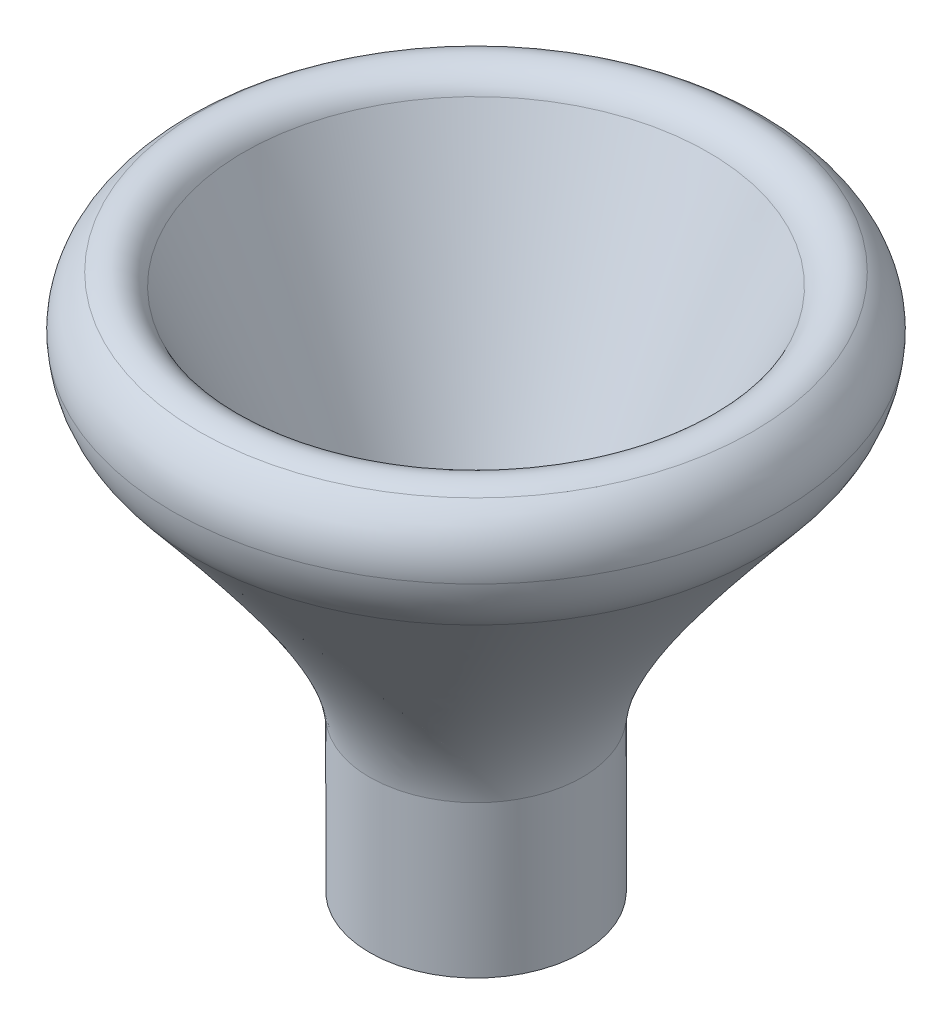
ISO-10303-21;
HEADER;
FILE_DESCRIPTION(('STEP AP214'),'2;1');
FILE_NAME('part.step','',(''),(''),'','','');
FILE_SCHEMA(('AUTOMOTIVE_DESIGN { 1 0 10303 214 1 1 1 1 }'));
ENDSEC;
DATA;
#1=APPLICATION_CONTEXT('core data for automotive mechanical design processes');
#2=APPLICATION_PROTOCOL_DEFINITION('international standard','automotive_design',2000,#1);
#3=PRODUCT_CONTEXT('',#1,'mechanical');
#4=PRODUCT('Part','Part','',(#3));
#5=PRODUCT_RELATED_PRODUCT_CATEGORY('part','',(#4));
#6=PRODUCT_DEFINITION_FORMATION('','',#4);
#7=PRODUCT_DEFINITION_CONTEXT('part definition',#1,'design');
#8=PRODUCT_DEFINITION('design','',#6,#7);
#9=PRODUCT_DEFINITION_SHAPE('','',#8);
#10=(LENGTH_UNIT() NAMED_UNIT(*) SI_UNIT(.MILLI.,.METRE.));
#11=(NAMED_UNIT(*) PLANE_ANGLE_UNIT() SI_UNIT($,.RADIAN.));
#12=(NAMED_UNIT(*) SI_UNIT($,.STERADIAN.) SOLID_ANGLE_UNIT());
#13=UNCERTAINTY_MEASURE_WITH_UNIT(LENGTH_MEASURE(1.E-05),#10,'distance_accuracy_value','');
#14=(GEOMETRIC_REPRESENTATION_CONTEXT(3) GLOBAL_UNCERTAINTY_ASSIGNED_CONTEXT((#13)) GLOBAL_UNIT_ASSIGNED_CONTEXT((#10,
#11,#12)) REPRESENTATION_CONTEXT('',''));
#15=CARTESIAN_POINT('',(0.,0.,0.));
#16=DIRECTION('',(0.,0.,1.));
#17=DIRECTION('',(1.,0.,0.));
#18=AXIS2_PLACEMENT_3D('',#15,#16,#17);
#19=CARTESIAN_POINT('',(0.,15.,0.));
#20=DIRECTION('',(0.,-1.,0.));
#21=DIRECTION('',(0.,0.,-1.));
#22=AXIS2_PLACEMENT_3D('',#19,#20,#21);
#23=CYLINDRICAL_SURFACE('',#22,2.);
#24=CARTESIAN_POINT('',(0.,7.15147181544506,0.));
#25=DIRECTION('',(0.,1.,0.));
#26=DIRECTION('',(0.,0.,1.));
#27=AXIS2_PLACEMENT_3D('',#24,#25,#26);
#28=CIRCLE('',#27,2.);
#29=CARTESIAN_POINT('',(0.,7.15147181544506,2.));
#30=VERTEX_POINT('',#29);
#31=EDGE_CURVE('E46',#30,#30,#28,.T.);
#32=ORIENTED_EDGE('',*,*,#31,.T.);
#33=EDGE_LOOP('',(#32));
#34=FACE_BOUND('',#33,.T.);
#35=CARTESIAN_POINT('',(0.,0.,0.));
#36=DIRECTION('',(0.,-1.,0.));
#37=DIRECTION('',(0.,0.,-1.));
#38=AXIS2_PLACEMENT_3D('',#35,#36,#37);
#39=CIRCLE('',#38,2.);
#40=CARTESIAN_POINT('',(0.,0.,-2.));
#41=VERTEX_POINT('',#40);
#42=EDGE_CURVE('E112',#41,#41,#39,.T.);
#43=ORIENTED_EDGE('',*,*,#42,.T.);
#44=EDGE_LOOP('',(#43));
#45=FACE_BOUND('',#44,.T.);
#46=ADVANCED_FACE('F35',(#34,#45),#23,.F.);
#47=CARTESIAN_POINT('',(2.41674228537619,5.,-2.53167073808477));
#48=CARTESIAN_POINT('',(9.5818954233782,15.,2.86134235900635));
#49=CARTESIAN_POINT('',(-2.64659919079335,5.,-7.36515530883714));
#50=CARTESIAN_POINT('',(15.3045801413909,15.,-16.30244848775));
#51=CARTESIAN_POINT('',(-7.48008376154572,5.,-2.3018138326676));
#52=CARTESIAN_POINT('',(-3.8592107053655,15.,-22.0251332057627));
#53=CARTESIAN_POINT('',(-2.41674228537619,5.,2.53167073808477));
#54=CARTESIAN_POINT('',(-9.58189542337819,15.,-2.86134235900635));
#55=CARTESIAN_POINT('',(2.64659919079335,5.,7.36515530883714));
#56=CARTESIAN_POINT('',(-15.3045801413909,15.,16.30244848775));
#57=CARTESIAN_POINT('',(7.48008376154573,5.,2.30181383266761));
#58=CARTESIAN_POINT('',(3.8592107053655,15.,22.0251332057627));
#59=CARTESIAN_POINT('',(2.41674228537619,5.,-2.53167073808477));
#60=CARTESIAN_POINT('',(9.5818954233782,15.,2.86134235900635));
#61=(BOUNDED_SURFACE() B_SPLINE_SURFACE(3,1,((#47,#48),(#49,#50),(#51,#52),(#53,#54),(#55,#56),
(#57,#58),(#59,#60)),.UNSPECIFIED.,.T.,.F.,.F.) B_SPLINE_SURFACE_WITH_KNOTS((4,3,4),(2,2),(0.,
0.5,1.),(0.,1.),.UNSPECIFIED.) GEOMETRIC_REPRESENTATION_ITEM() RATIONAL_B_SPLINE_SURFACE(((1.,
1.),(0.333333333333334,0.333333333333333),(0.333333333333334,0.333333333333333),(1.,1.),
(0.333333333333333,0.333333333333333),(0.333333333333333,0.333333333333333),(1.,1.))) REPRESENTATION_ITEM('') SURFACE());
#62=CARTESIAN_POINT('',(0.,14.17075547367,0.));
#63=DIRECTION('',(0.,1.,0.));
#64=DIRECTION('',(0.,0.,1.));
#65=AXIS2_PLACEMENT_3D('',#62,#63,#64);
#66=CIRCLE('',#65,9.3063040552947);
#67=CARTESIAN_POINT('',(0.,14.17075547367,9.3063040552947));
#68=VERTEX_POINT('',#67);
#69=EDGE_CURVE('E61',#68,#68,#66,.F.);
#70=CARTESIAN_POINT('',(2.41674228537624,5.00000000000008,-2.53167073808473));
#71=CARTESIAN_POINT('',(-2.64659919079321,5.00000000000008,-7.36515530883721));
#72=CARTESIAN_POINT('',(-7.4800837615457,5.00000000000008,-2.30181383266776));
#73=CARTESIAN_POINT('',(-2.41674228537624,5.00000000000008,2.53167073808473));
#74=CARTESIAN_POINT('',(2.64659919079321,5.00000000000008,7.36515530883721));
#75=CARTESIAN_POINT('',(7.4800837615457,5.00000000000008,2.30181383266776));
#76=CARTESIAN_POINT('',(2.41674228537624,5.00000000000008,-2.53167073808473));
#77=(BOUNDED_CURVE() B_SPLINE_CURVE(3,(#70,#71,#72,#73,#74,#75,#76),.UNSPECIFIED.,.T.,
.F.) B_SPLINE_CURVE_WITH_KNOTS((4,3,4),(0.,0.5,1.),
.UNSPECIFIED.) CURVE() GEOMETRIC_REPRESENTATION_ITEM() RATIONAL_B_SPLINE_CURVE((1.,
0.333333333333334,0.333333333333334,1.,0.333333333333333,0.333333333333333,1.)) REPRESENTATION_ITEM(''));
#78=CARTESIAN_POINT('',(0.,5.00000000000008,3.50000000000001));
#79=VERTEX_POINT('',#78);
#80=EDGE_CURVE('E64',#79,#79,#77,.T.);
#81=ORIENTED_EDGE('',*,*,#69,.T.);
#82=EDGE_LOOP('',(#81));
#83=FACE_BOUND('',#82,.T.);
#84=ORIENTED_EDGE('',*,*,#80,.T.);
#85=EDGE_LOOP('',(#84));
#86=FACE_BOUND('',#85,.T.);
#87=ADVANCED_FACE('F82',(#83,#86),#61,.T.);
#88=CARTESIAN_POINT('',(0.,5.,0.));
#89=DIRECTION('',(0.,-1.,0.));
#90=DIRECTION('',(0.,0.,-1.));
#91=AXIS2_PLACEMENT_3D('',#88,#89,#90);
#92=CYLINDRICAL_SURFACE('',#91,3.5);
#93=ORIENTED_EDGE('',*,*,#80,.F.);
#94=EDGE_LOOP('',(#93));
#95=FACE_BOUND('',#94,.T.);
#96=CARTESIAN_POINT('',(0.,0.,0.));
#97=DIRECTION('',(0.,1.,0.));
#98=DIRECTION('',(0.,0.,1.));
#99=AXIS2_PLACEMENT_3D('',#96,#97,#98);
#100=CIRCLE('',#99,3.5);
#101=CARTESIAN_POINT('',(0.,0.,3.5));
#102=VERTEX_POINT('',#101);
#103=EDGE_CURVE('E109',#102,#102,#100,.T.);
#104=ORIENTED_EDGE('',*,*,#103,.T.);
#105=EDGE_LOOP('',(#104));
#106=FACE_BOUND('',#105,.T.);
#107=ADVANCED_FACE('F71',(#95,#106),#92,.T.);
#108=CARTESIAN_POINT('',(0.,0.,0.));
#109=DIRECTION('',(0.,1.,0.));
#110=DIRECTION('',(0.,0.,1.));
#111=AXIS2_PLACEMENT_3D('',#108,#109,#110);
#112=PLANE('',#111);
#113=ORIENTED_EDGE('',*,*,#42,.F.);
#114=EDGE_LOOP('',(#113));
#115=FACE_BOUND('',#114,.T.);
#116=ORIENTED_EDGE('',*,*,#103,.F.);
#117=EDGE_LOOP('',(#116));
#118=FACE_BOUND('',#117,.T.);
#119=ADVANCED_FACE('F81',(#115,#118),#112,.F.);
#120=CARTESIAN_POINT('',(0.,16.0893387021308,0.));
#121=DIRECTION('',(0.,-1.,0.));
#122=DIRECTION('',(0.,0.,-1.));
#123=AXIS2_PLACEMENT_3D('',#120,#121,#122);
#124=TOROIDAL_SURFACE('',#123,7.,3.);
#125=CARTESIAN_POINT('',(0.,15.8213225957383,0.));
#126=DIRECTION('',(0.,1.,0.));
#127=DIRECTION('',(0.,0.,1.));
#128=AXIS2_PLACEMENT_3D('',#125,#126,#127);
#129=CIRCLE('',#128,9.98800391009018);
#130=CARTESIAN_POINT('',(0.,15.8213225957383,9.98800391009018));
#131=VERTEX_POINT('',#130);
#132=EDGE_CURVE('E58',#131,#131,#129,.F.);
#133=ORIENTED_EDGE('',*,*,#132,.T.);
#134=EDGE_LOOP('',(#133));
#135=FACE_BOUND('',#134,.T.);
#136=ORIENTED_EDGE('',*,*,#69,.F.);
#137=EDGE_LOOP('',(#136));
#138=FACE_BOUND('',#137,.T.);
#139=ADVANCED_FACE('F91',(#135,#138),#124,.T.);
#140=CARTESIAN_POINT('',(0.,16.,0.));
#141=DIRECTION('',(0.,1.,0.));
#142=DIRECTION('',(0.,0.,1.));
#143=AXIS2_PLACEMENT_3D('',#140,#141,#142);
#144=TOROIDAL_SURFACE('',#143,7.99600130336339,2.);
#145=CARTESIAN_POINT('',(0.,17.6599646241956,0.));
#146=DIRECTION('',(0.,-1.,0.));
#147=DIRECTION('',(0.,0.,-1.));
#148=AXIS2_PLACEMENT_3D('',#145,#146,#147);
#149=CIRCLE('',#148,9.11158072519719);
#150=CARTESIAN_POINT('',(0.,17.6599646241956,-9.11158072519719));
#151=VERTEX_POINT('',#150);
#152=EDGE_CURVE('E11',#151,#151,#149,.T.);
#153=ORIENTED_EDGE('',*,*,#152,.T.);
#154=EDGE_LOOP('',(#153));
#155=FACE_BOUND('',#154,.T.);
#156=ORIENTED_EDGE('',*,*,#132,.F.);
#157=EDGE_LOOP('',(#156));
#158=FACE_BOUND('',#157,.T.);
#159=ADVANCED_FACE('F124',(#155,#158),#144,.T.);
#160=CARTESIAN_POINT('',(0.,18.,0.));
#161=DIRECTION('',(0.,1.,0.));
#162=DIRECTION('',(0.,0.,1.));
#163=AXIS2_PLACEMENT_3D('',#160,#161,#162);
#164=CONICAL_SURFACE('',#163,7.99600130336339,0.436332312998583);
#165=CARTESIAN_POINT('',(0.,17.2526005738385,0.));
#166=DIRECTION('',(0.,1.,0.));
#167=DIRECTION('',(0.,0.,1.));
#168=AXIS2_PLACEMENT_3D('',#165,#166,#167);
#169=CIRCLE('',#168,7.64748322724364);
#170=CARTESIAN_POINT('',(0.,17.2526005738385,7.64748322724364));
#171=VERTEX_POINT('',#170);
#172=EDGE_CURVE('E42',#171,#171,#169,.T.);
#173=ORIENTED_EDGE('',*,*,#172,.T.);
#174=EDGE_LOOP('',(#173));
#175=FACE_BOUND('',#174,.T.);
#176=CARTESIAN_POINT('',(0.,9.1547634765186,0.));
#177=DIRECTION('',(0.,-1.,0.));
#178=DIRECTION('',(0.,0.,-1.));
#179=AXIS2_PLACEMENT_3D('',#176,#177,#178);
#180=CIRCLE('',#179,3.87139977427172);
#181=CARTESIAN_POINT('',(0.,9.1547634765186,-3.87139977427172));
#182=VERTEX_POINT('',#181);
#183=EDGE_CURVE('E55',#182,#182,#180,.T.);
#184=ORIENTED_EDGE('',*,*,#183,.T.);
#185=EDGE_LOOP('',(#184));
#186=FACE_BOUND('',#185,.T.);
#187=ADVANCED_FACE('F131',(#175,#186),#164,.F.);
#188=CARTESIAN_POINT('',(0.,10.,0.));
#189=DIRECTION('',(0.,1.,0.));
#190=DIRECTION('',(0.,0.,1.));
#191=AXIS2_PLACEMENT_3D('',#188,#189,#190);
#192=TOROIDAL_SURFACE('',#191,2.05878420019842,2.);
#193=CARTESIAN_POINT('',(0.,8.10098121029671,0.));
#194=DIRECTION('',(0.,1.,0.));
#195=DIRECTION('',(0.,0.,1.));
#196=AXIS2_PLACEMENT_3D('',#193,#194,#195);
#197=CIRCLE('',#196,2.68626140006614);
#198=CARTESIAN_POINT('',(0.,8.10098121029671,2.68626140006614));
#199=VERTEX_POINT('',#198);
#200=EDGE_CURVE('E50',#199,#199,#197,.F.);
#201=ORIENTED_EDGE('',*,*,#200,.T.);
#202=EDGE_LOOP('',(#201));
#203=FACE_BOUND('',#202,.T.);
#204=ORIENTED_EDGE('',*,*,#183,.F.);
#205=EDGE_LOOP('',(#204));
#206=FACE_BOUND('',#205,.T.);
#207=ADVANCED_FACE('F133',(#203,#206),#192,.F.);
#208=CARTESIAN_POINT('',(0.,7.15147181544506,0.));
#209=DIRECTION('',(0.,1.,0.));
#210=DIRECTION('',(0.,0.,1.));
#211=AXIS2_PLACEMENT_3D('',#208,#209,#210);
#212=TOROIDAL_SURFACE('',#211,3.,1.);
#213=ORIENTED_EDGE('',*,*,#31,.F.);
#214=EDGE_LOOP('',(#213));
#215=FACE_BOUND('',#214,.T.);
#216=ORIENTED_EDGE('',*,*,#200,.F.);
#217=EDGE_LOOP('',(#216));
#218=FACE_BOUND('',#217,.T.);
#219=ADVANCED_FACE('F138',(#215,#218),#212,.T.);
#220=CARTESIAN_POINT('',(0.,16.8299823120978,0.));
#221=DIRECTION('',(0.,-1.,0.));
#222=DIRECTION('',(0.,0.,-1.));
#223=AXIS2_PLACEMENT_3D('',#220,#221,#222);
#224=TOROIDAL_SURFACE('',#223,8.55379101428029,1.);
#225=ORIENTED_EDGE('',*,*,#152,.F.);
#226=EDGE_LOOP('',(#225));
#227=FACE_BOUND('',#226,.T.);
#228=ORIENTED_EDGE('',*,*,#172,.F.);
#229=EDGE_LOOP('',(#228));
#230=FACE_BOUND('',#229,.T.);
#231=ADVANCED_FACE('F37',(#227,#230),#224,.T.);
#232=CLOSED_SHELL('',(#46,#87,#107,#119,#139,#159,#187,#207,#219,#231));
#233=MANIFOLD_SOLID_BREP('B2',#232);
#234=ADVANCED_BREP_SHAPE_REPRESENTATION('',(#18,#233),#14);
#235=SHAPE_DEFINITION_REPRESENTATION(#9,#234);
ENDSEC;
END-ISO-10303-21;
